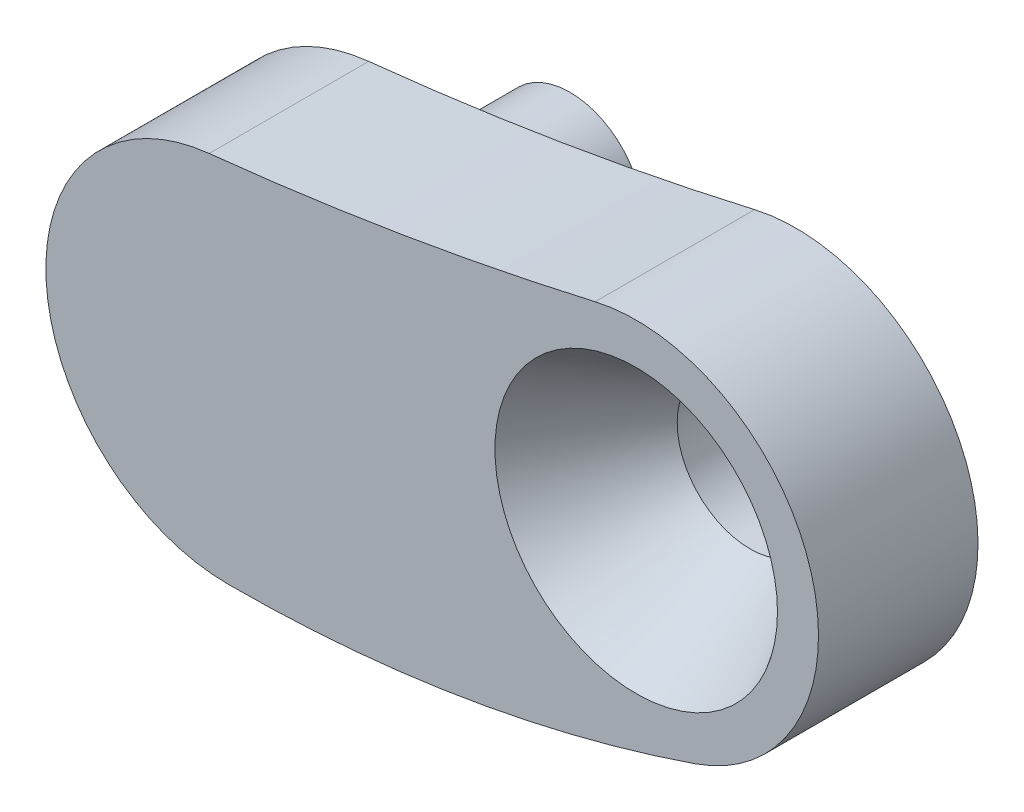
ISO-10303-21;
HEADER;
FILE_DESCRIPTION(('STEP AP214'),'2;1');
FILE_NAME('part.step','',(''),(''),'','','');
FILE_SCHEMA(('AUTOMOTIVE_DESIGN { 1 0 10303 214 1 1 1 1 }'));
ENDSEC;
DATA;
#1=APPLICATION_CONTEXT('core data for automotive mechanical design processes');
#2=APPLICATION_PROTOCOL_DEFINITION('international standard','automotive_design',2000,#1);
#3=PRODUCT_CONTEXT('',#1,'mechanical');
#4=PRODUCT('Part','Part','',(#3));
#5=PRODUCT_RELATED_PRODUCT_CATEGORY('part','',(#4));
#6=PRODUCT_DEFINITION_FORMATION('','',#4);
#7=PRODUCT_DEFINITION_CONTEXT('part definition',#1,'design');
#8=PRODUCT_DEFINITION('design','',#6,#7);
#9=PRODUCT_DEFINITION_SHAPE('','',#8);
#10=(LENGTH_UNIT() NAMED_UNIT(*) SI_UNIT(.MILLI.,.METRE.));
#11=(NAMED_UNIT(*) PLANE_ANGLE_UNIT() SI_UNIT($,.RADIAN.));
#12=(NAMED_UNIT(*) SI_UNIT($,.STERADIAN.) SOLID_ANGLE_UNIT());
#13=UNCERTAINTY_MEASURE_WITH_UNIT(LENGTH_MEASURE(1.E-05),#10,'distance_accuracy_value','');
#14=(GEOMETRIC_REPRESENTATION_CONTEXT(3) GLOBAL_UNCERTAINTY_ASSIGNED_CONTEXT((#13)) GLOBAL_UNIT_ASSIGNED_CONTEXT((#10,
#11,#12)) REPRESENTATION_CONTEXT('',''));
#15=CARTESIAN_POINT('',(0.,0.,0.));
#16=DIRECTION('',(0.,0.,1.));
#17=DIRECTION('',(1.,0.,0.));
#18=AXIS2_PLACEMENT_3D('',#15,#16,#17);
#19=CARTESIAN_POINT('',(0.,-27.5,4.));
#20=DIRECTION('',(0.,0.,-1.));
#21=DIRECTION('',(-1.,0.,0.));
#22=AXIS2_PLACEMENT_3D('',#19,#20,#21);
#23=CYLINDRICAL_SURFACE('',#22,4.);
#24=CARTESIAN_POINT('',(0.,-27.5,3.5));
#25=DIRECTION('',(0.,0.,1.));
#26=DIRECTION('',(1.,0.,0.));
#27=AXIS2_PLACEMENT_3D('',#24,#25,#26);
#28=CIRCLE('',#27,4.);
#29=CARTESIAN_POINT('',(-0.416971099482422,-23.521792476228,3.5));
#30=VERTEX_POINT('',#29);
#31=CARTESIAN_POINT('',(0.,-31.5,3.5));
#32=VERTEX_POINT('',#31);
#33=EDGE_CURVE('E88',#30,#32,#28,.T.);
#34=ORIENTED_EDGE('',*,*,#33,.F.);
#35=DIRECTION('',(0.,0.,-1.));
#36=VECTOR('',#35,1.);
#37=CARTESIAN_POINT('',(-0.416971099482422,-23.521792476228,4.));
#38=LINE('',#37,#36);
#39=CARTESIAN_POINT('',(-0.416971099482422,-23.521792476228,0.));
#40=VERTEX_POINT('',#39);
#41=EDGE_CURVE('E69',#30,#40,#38,.T.);
#42=ORIENTED_EDGE('',*,*,#41,.T.);
#43=CARTESIAN_POINT('',(0.,-27.5,0.));
#44=DIRECTION('',(0.,0.,1.));
#45=DIRECTION('',(1.,0.,0.));
#46=AXIS2_PLACEMENT_3D('',#43,#44,#45);
#47=CIRCLE('',#46,4.);
#48=CARTESIAN_POINT('',(0.,-31.5,0.));
#49=VERTEX_POINT('',#48);
#50=EDGE_CURVE('E124',#40,#49,#47,.T.);
#51=ORIENTED_EDGE('',*,*,#50,.T.);
#52=DIRECTION('',(0.,0.,-1.));
#53=VECTOR('',#52,1.);
#54=CARTESIAN_POINT('',(0.,-31.5,4.));
#55=LINE('',#54,#53);
#56=EDGE_CURVE('E11',#32,#49,#55,.T.);
#57=ORIENTED_EDGE('',*,*,#56,.F.);
#58=EDGE_LOOP('',(#34,#42,#51,#57));
#59=FACE_BOUND('',#58,.T.);
#60=ADVANCED_FACE('F45',(#59),#23,.T.);
#61=CARTESIAN_POINT('',(0.,0.,4.));
#62=DIRECTION('',(0.,0.,-1.));
#63=DIRECTION('',(-1.,0.,0.));
#64=AXIS2_PLACEMENT_3D('',#61,#62,#63);
#65=CYLINDRICAL_SURFACE('',#64,31.5);
#66=CARTESIAN_POINT('',(0.,0.,3.5));
#67=DIRECTION('',(0.,0.,1.));
#68=DIRECTION('',(1.,0.,0.));
#69=AXIS2_PLACEMENT_3D('',#66,#67,#68);
#70=CIRCLE('',#69,31.5);
#71=CARTESIAN_POINT('',(10.2553968654005,-29.7838351313785,3.5));
#72=VERTEX_POINT('',#71);
#73=EDGE_CURVE('E96',#32,#72,#70,.T.);
#74=ORIENTED_EDGE('',*,*,#73,.F.);
#75=ORIENTED_EDGE('',*,*,#56,.T.);
#76=CARTESIAN_POINT('',(0.,0.,0.));
#77=DIRECTION('',(0.,0.,1.));
#78=DIRECTION('',(1.,0.,0.));
#79=AXIS2_PLACEMENT_3D('',#76,#77,#78);
#80=CIRCLE('',#79,31.5);
#81=CARTESIAN_POINT('',(10.2553968654005,-29.7838351313785,0.));
#82=VERTEX_POINT('',#81);
#83=EDGE_CURVE('E120',#49,#82,#80,.T.);
#84=ORIENTED_EDGE('',*,*,#83,.T.);
#85=DIRECTION('',(0.,0.,-1.));
#86=VECTOR('',#85,1.);
#87=CARTESIAN_POINT('',(10.2553968654005,-29.7838351313785,4.));
#88=LINE('',#87,#86);
#89=EDGE_CURVE('E54',#72,#82,#88,.T.);
#90=ORIENTED_EDGE('',*,*,#89,.F.);
#91=EDGE_LOOP('',(#74,#75,#84,#90));
#92=FACE_BOUND('',#91,.T.);
#93=ADVANCED_FACE('F121',(#92),#65,.T.);
#94=CARTESIAN_POINT('',(8.95312424757184,-26.0017608289812,4.));
#95=DIRECTION('',(0.,0.,-1.));
#96=DIRECTION('',(-1.,0.,0.));
#97=AXIS2_PLACEMENT_3D('',#94,#95,#96);
#98=CYLINDRICAL_SURFACE('',#97,3.99999999999999);
#99=CARTESIAN_POINT('',(8.95312424757184,-26.0017608289812,3.5));
#100=DIRECTION('',(0.,0.,1.));
#101=DIRECTION('',(1.,0.,0.));
#102=AXIS2_PLACEMENT_3D('',#99,#100,#101);
#103=CIRCLE('',#102,4.);
#104=CARTESIAN_POINT('',(8.0522004860585,-22.1045392063453,3.5));
#105=VERTEX_POINT('',#104);
#106=EDGE_CURVE('E61',#72,#105,#103,.T.);
#107=ORIENTED_EDGE('',*,*,#106,.F.);
#108=ORIENTED_EDGE('',*,*,#89,.T.);
#109=CARTESIAN_POINT('',(8.95312424757184,-26.0017608289812,0.));
#110=DIRECTION('',(0.,0.,1.));
#111=DIRECTION('',(1.,0.,0.));
#112=AXIS2_PLACEMENT_3D('',#109,#110,#111);
#113=CIRCLE('',#112,3.99999999999999);
#114=CARTESIAN_POINT('',(8.0522004860585,-22.1045392063453,0.));
#115=VERTEX_POINT('',#114);
#116=EDGE_CURVE('E108',#82,#115,#113,.T.);
#117=ORIENTED_EDGE('',*,*,#116,.T.);
#118=DIRECTION('',(0.,0.,-1.));
#119=VECTOR('',#118,1.);
#120=CARTESIAN_POINT('',(8.0522004860585,-22.1045392063453,4.));
#121=LINE('',#120,#119);
#122=EDGE_CURVE('E103',#105,#115,#121,.T.);
#123=ORIENTED_EDGE('',*,*,#122,.F.);
#124=EDGE_LOOP('',(#107,#108,#117,#123));
#125=FACE_BOUND('',#124,.T.);
#126=ADVANCED_FACE('F116',(#125),#98,.T.);
#127=CARTESIAN_POINT('',(-7.71396534042486,46.0968391897826,4.));
#128=DIRECTION('',(0.,0.,-1.));
#129=DIRECTION('',(-1.,0.,0.));
#130=AXIS2_PLACEMENT_3D('',#127,#128,#129);
#131=CYLINDRICAL_SURFACE('',#130,70.);
#132=ORIENTED_EDGE('',*,*,#41,.F.);
#133=CARTESIAN_POINT('',(-7.71396534042486,46.0968391897826,3.5));
#134=DIRECTION('',(0.,0.,-1.));
#135=DIRECTION('',(1.,0.,0.));
#136=AXIS2_PLACEMENT_3D('',#133,#134,#135);
#137=CIRCLE('',#136,70.);
#138=EDGE_CURVE('E85',#105,#30,#137,.T.);
#139=ORIENTED_EDGE('',*,*,#138,.F.);
#140=ORIENTED_EDGE('',*,*,#122,.T.);
#141=CARTESIAN_POINT('',(-7.71396534042486,46.0968391897826,0.));
#142=DIRECTION('',(0.,0.,1.));
#143=DIRECTION('',(1.,0.,0.));
#144=AXIS2_PLACEMENT_3D('',#141,#142,#143);
#145=CIRCLE('',#144,70.);
#146=EDGE_CURVE('E101',#40,#115,#145,.T.);
#147=ORIENTED_EDGE('',*,*,#146,.F.);
#148=EDGE_LOOP('',(#132,#139,#140,#147));
#149=FACE_BOUND('',#148,.T.);
#150=ADVANCED_FACE('F99',(#149),#131,.F.);
#151=CARTESIAN_POINT('',(8.95312424757184,-26.0017608289812,4.));
#152=DIRECTION('',(0.,0.,-1.));
#153=DIRECTION('',(-1.,0.,0.));
#154=AXIS2_PLACEMENT_3D('',#151,#152,#153);
#155=CYLINDRICAL_SURFACE('',#154,1.6);
#156=CARTESIAN_POINT('',(8.95312424757184,-26.0017608289812,1.));
#157=DIRECTION('',(0.,0.,-1.));
#158=DIRECTION('',(-1.,0.,0.));
#159=AXIS2_PLACEMENT_3D('',#156,#157,#158);
#160=CIRCLE('',#159,1.6);
#161=CARTESIAN_POINT('',(7.35312424757184,-26.0017608289812,1.));
#162=VERTEX_POINT('',#161);
#163=EDGE_CURVE('E140',#162,#162,#160,.T.);
#164=ORIENTED_EDGE('',*,*,#163,.F.);
#165=EDGE_LOOP('',(#164));
#166=FACE_BOUND('',#165,.T.);
#167=CARTESIAN_POINT('',(8.95312424757184,-26.0017608289812,0.));
#168=DIRECTION('',(0.,0.,1.));
#169=DIRECTION('',(1.,0.,0.));
#170=AXIS2_PLACEMENT_3D('',#167,#168,#169);
#171=CIRCLE('',#170,1.6);
#172=CARTESIAN_POINT('',(10.5531242475718,-26.0017608289812,0.));
#173=VERTEX_POINT('',#172);
#174=EDGE_CURVE('E131',#173,#173,#171,.T.);
#175=ORIENTED_EDGE('',*,*,#174,.F.);
#176=EDGE_LOOP('',(#175));
#177=FACE_BOUND('',#176,.T.);
#178=ADVANCED_FACE('F47',(#166,#177),#155,.F.);
#179=CARTESIAN_POINT('',(0.,0.,0.));
#180=DIRECTION('',(0.,0.,1.));
#181=DIRECTION('',(1.,0.,0.));
#182=AXIS2_PLACEMENT_3D('',#179,#180,#181);
#183=PLANE('',#182);
#184=CARTESIAN_POINT('',(0.,-27.5,0.));
#185=DIRECTION('',(0.,0.,1.));
#186=DIRECTION('',(1.,0.,0.));
#187=AXIS2_PLACEMENT_3D('',#184,#185,#186);
#188=CIRCLE('',#187,1.6);
#189=CARTESIAN_POINT('',(1.6,-27.5,0.));
#190=VERTEX_POINT('',#189);
#191=EDGE_CURVE('E136',#190,#190,#188,.T.);
#192=ORIENTED_EDGE('',*,*,#191,.T.);
#193=EDGE_LOOP('',(#192));
#194=FACE_BOUND('',#193,.T.);
#195=ORIENTED_EDGE('',*,*,#174,.T.);
#196=EDGE_LOOP('',(#195));
#197=FACE_BOUND('',#196,.T.);
#198=ORIENTED_EDGE('',*,*,#50,.F.);
#199=ORIENTED_EDGE('',*,*,#146,.T.);
#200=ORIENTED_EDGE('',*,*,#116,.F.);
#201=ORIENTED_EDGE('',*,*,#83,.F.);
#202=EDGE_LOOP('',(#198,#199,#200,#201));
#203=FACE_BOUND('',#202,.T.);
#204=ADVANCED_FACE('F126',(#194,#197,#203),#183,.F.);
#205=CARTESIAN_POINT('',(0.,-27.5,-4.));
#206=DIRECTION('',(0.,0.,1.));
#207=DIRECTION('',(1.,0.,0.));
#208=AXIS2_PLACEMENT_3D('',#205,#206,#207);
#209=CYLINDRICAL_SURFACE('',#208,1.6);
#210=CARTESIAN_POINT('',(0.,-27.5,-4.));
#211=DIRECTION('',(0.,0.,1.));
#212=DIRECTION('',(1.,0.,0.));
#213=AXIS2_PLACEMENT_3D('',#210,#211,#212);
#214=CIRCLE('',#213,1.6);
#215=CARTESIAN_POINT('',(1.6,-27.5,-4.));
#216=VERTEX_POINT('',#215);
#217=EDGE_CURVE('E135',#216,#216,#214,.T.);
#218=ORIENTED_EDGE('',*,*,#217,.T.);
#219=EDGE_LOOP('',(#218));
#220=FACE_BOUND('',#219,.T.);
#221=ORIENTED_EDGE('',*,*,#191,.F.);
#222=EDGE_LOOP('',(#221));
#223=FACE_BOUND('',#222,.T.);
#224=ADVANCED_FACE('F168',(#220,#223),#209,.T.);
#225=CARTESIAN_POINT('',(0.,-27.5,-4.));
#226=DIRECTION('',(0.,0.,1.));
#227=DIRECTION('',(1.,0.,0.));
#228=AXIS2_PLACEMENT_3D('',#225,#226,#227);
#229=PLANE('',#228);
#230=ORIENTED_EDGE('',*,*,#217,.F.);
#231=EDGE_LOOP('',(#230));
#232=FACE_BOUND('',#231,.T.);
#233=ADVANCED_FACE('F159',(#232),#229,.F.);
#234=CARTESIAN_POINT('',(8.95312424757184,-26.0017608289812,1.));
#235=DIRECTION('',(0.,0.,1.));
#236=DIRECTION('',(1.,0.,0.));
#237=AXIS2_PLACEMENT_3D('',#234,#235,#236);
#238=CONICAL_SURFACE('',#237,1.6,0.540419500270584);
#239=CARTESIAN_POINT('',(8.95312424757184,-26.0017608289812,3.5));
#240=DIRECTION('',(0.,0.,1.));
#241=DIRECTION('',(1.,0.,0.));
#242=AXIS2_PLACEMENT_3D('',#239,#240,#241);
#243=CIRCLE('',#242,3.1);
#244=CARTESIAN_POINT('',(12.0531242475718,-26.0017608289812,3.5));
#245=VERTEX_POINT('',#244);
#246=EDGE_CURVE('E147',#245,#245,#243,.F.);
#247=ORIENTED_EDGE('',*,*,#246,.F.);
#248=EDGE_LOOP('',(#247));
#249=FACE_BOUND('',#248,.T.);
#250=ORIENTED_EDGE('',*,*,#163,.T.);
#251=EDGE_LOOP('',(#250));
#252=FACE_BOUND('',#251,.T.);
#253=ADVANCED_FACE('F156',(#249,#252),#238,.F.);
#254=CARTESIAN_POINT('',(0.619579453573486,10.0475391804007,3.5));
#255=DIRECTION('',(0.,0.,1.));
#256=DIRECTION('',(1.,0.,0.));
#257=AXIS2_PLACEMENT_3D('',#254,#255,#256);
#258=PLANE('',#257);
#259=ORIENTED_EDGE('',*,*,#138,.T.);
#260=ORIENTED_EDGE('',*,*,#33,.T.);
#261=ORIENTED_EDGE('',*,*,#73,.T.);
#262=ORIENTED_EDGE('',*,*,#106,.T.);
#263=EDGE_LOOP('',(#259,#260,#261,#262));
#264=FACE_BOUND('',#263,.T.);
#265=ORIENTED_EDGE('',*,*,#246,.T.);
#266=EDGE_LOOP('',(#265));
#267=FACE_BOUND('',#266,.T.);
#268=ADVANCED_FACE('F86',(#264,#267),#258,.T.);
#269=CLOSED_SHELL('',(#60,#93,#126,#150,#178,#204,#224,#233,#253,#268));
#270=MANIFOLD_SOLID_BREP('B2',#269);
#271=ADVANCED_BREP_SHAPE_REPRESENTATION('',(#18,#270),#14);
#272=SHAPE_DEFINITION_REPRESENTATION(#9,#271);
ENDSEC;
END-ISO-10303-21;
